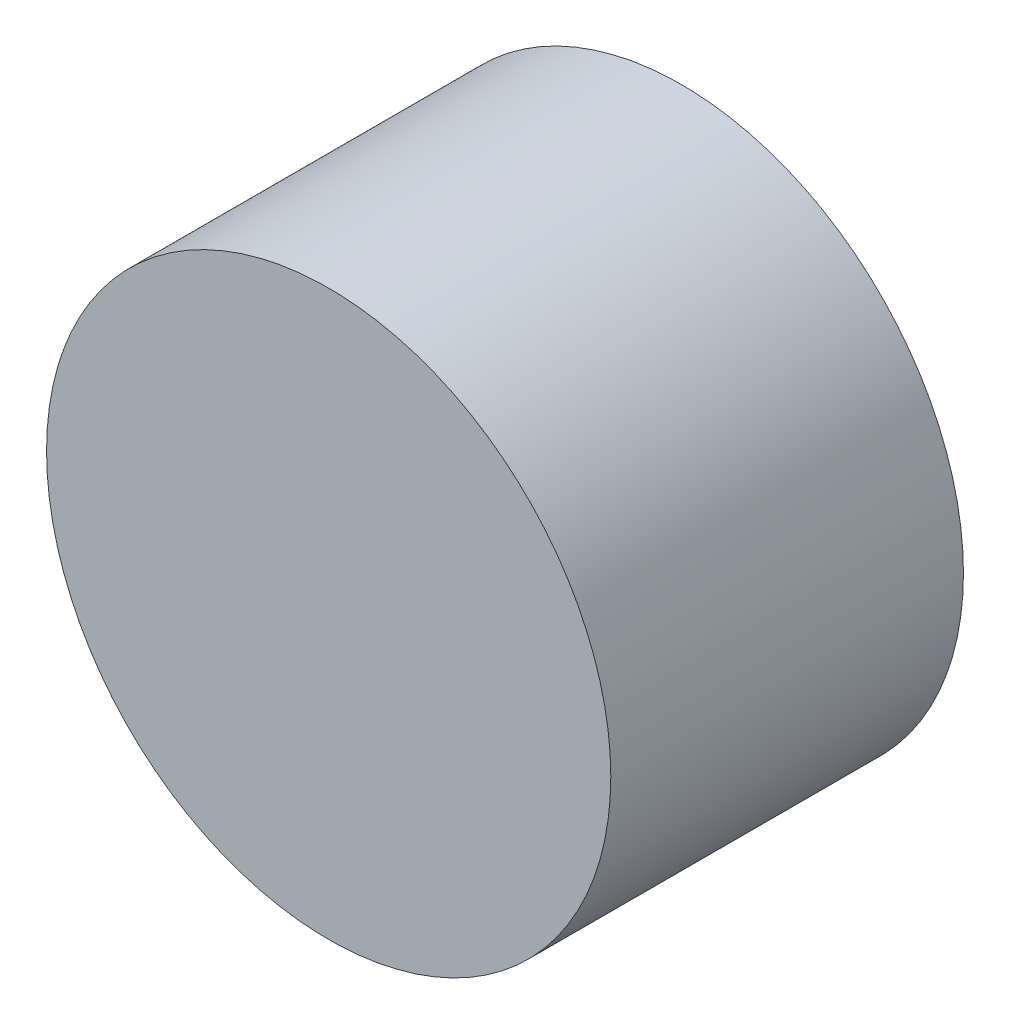
ISO-10303-21;
HEADER;
FILE_DESCRIPTION(('STEP AP214'),'2;1');
FILE_NAME('part.step','',(''),(''),'','','');
FILE_SCHEMA(('AUTOMOTIVE_DESIGN { 1 0 10303 214 1 1 1 1 }'));
ENDSEC;
DATA;
#1=APPLICATION_CONTEXT('core data for automotive mechanical design processes');
#2=APPLICATION_PROTOCOL_DEFINITION('international standard','automotive_design',2000,#1);
#3=PRODUCT_CONTEXT('',#1,'mechanical');
#4=PRODUCT('Part','Part','',(#3));
#5=PRODUCT_RELATED_PRODUCT_CATEGORY('part','',(#4));
#6=PRODUCT_DEFINITION_FORMATION('','',#4);
#7=PRODUCT_DEFINITION_CONTEXT('part definition',#1,'design');
#8=PRODUCT_DEFINITION('design','',#6,#7);
#9=PRODUCT_DEFINITION_SHAPE('','',#8);
#10=(LENGTH_UNIT() NAMED_UNIT(*) SI_UNIT(.MILLI.,.METRE.));
#11=(NAMED_UNIT(*) PLANE_ANGLE_UNIT() SI_UNIT($,.RADIAN.));
#12=(NAMED_UNIT(*) SI_UNIT($,.STERADIAN.) SOLID_ANGLE_UNIT());
#13=UNCERTAINTY_MEASURE_WITH_UNIT(LENGTH_MEASURE(1.E-05),#10,'distance_accuracy_value','');
#14=(GEOMETRIC_REPRESENTATION_CONTEXT(3) GLOBAL_UNCERTAINTY_ASSIGNED_CONTEXT((#13)) GLOBAL_UNIT_ASSIGNED_CONTEXT((#10,
#11,#12)) REPRESENTATION_CONTEXT('',''));
#15=CARTESIAN_POINT('',(0.,0.,0.));
#16=DIRECTION('',(0.,0.,1.));
#17=DIRECTION('',(1.,0.,0.));
#18=AXIS2_PLACEMENT_3D('',#15,#16,#17);
#19=CARTESIAN_POINT('',(0.,0.,0.));
#20=DIRECTION('',(0.,0.,1.));
#21=DIRECTION('',(1.,0.,0.));
#22=AXIS2_PLACEMENT_3D('',#19,#20,#21);
#23=PLANE('',#22);
#24=CARTESIAN_POINT('',(0.,0.,0.));
#25=DIRECTION('',(0.,0.,-1.));
#26=DIRECTION('',(-1.,0.,0.));
#27=AXIS2_PLACEMENT_3D('',#24,#25,#26);
#28=CIRCLE('',#27,3.2);
#29=CARTESIAN_POINT('',(-3.2,0.,0.));
#30=VERTEX_POINT('',#29);
#31=EDGE_CURVE('E43',#30,#30,#28,.T.);
#32=ORIENTED_EDGE('',*,*,#31,.T.);
#33=EDGE_LOOP('',(#32));
#34=FACE_BOUND('',#33,.T.);
#35=ADVANCED_FACE('F40',(#34),#23,.F.);
#36=CARTESIAN_POINT('',(0.,0.,4.));
#37=DIRECTION('',(0.,0.,-1.));
#38=DIRECTION('',(-1.,0.,0.));
#39=AXIS2_PLACEMENT_3D('',#36,#37,#38);
#40=CYLINDRICAL_SURFACE('',#39,3.2);
#41=CARTESIAN_POINT('',(0.,0.,4.));
#42=DIRECTION('',(0.,0.,-1.));
#43=DIRECTION('',(-1.,0.,0.));
#44=AXIS2_PLACEMENT_3D('',#41,#42,#43);
#45=CIRCLE('',#44,3.2);
#46=CARTESIAN_POINT('',(-3.2,0.,4.));
#47=VERTEX_POINT('',#46);
#48=EDGE_CURVE('E11',#47,#47,#45,.T.);
#49=ORIENTED_EDGE('',*,*,#48,.T.);
#50=EDGE_LOOP('',(#49));
#51=FACE_BOUND('',#50,.T.);
#52=ORIENTED_EDGE('',*,*,#31,.F.);
#53=EDGE_LOOP('',(#52));
#54=FACE_BOUND('',#53,.T.);
#55=ADVANCED_FACE('F53',(#51,#54),#40,.T.);
#56=CARTESIAN_POINT('',(0.,0.,4.));
#57=DIRECTION('',(0.,0.,1.));
#58=DIRECTION('',(1.,0.,0.));
#59=AXIS2_PLACEMENT_3D('',#56,#57,#58);
#60=PLANE('',#59);
#61=ORIENTED_EDGE('',*,*,#48,.F.);
#62=EDGE_LOOP('',(#61));
#63=FACE_BOUND('',#62,.T.);
#64=ADVANCED_FACE('F55',(#63),#60,.T.);
#65=CLOSED_SHELL('',(#35,#55,#64));
#66=MANIFOLD_SOLID_BREP('B2',#65);
#67=ADVANCED_BREP_SHAPE_REPRESENTATION('',(#18,#66),#14);
#68=SHAPE_DEFINITION_REPRESENTATION(#9,#67);
ENDSEC;
END-ISO-10303-21;
